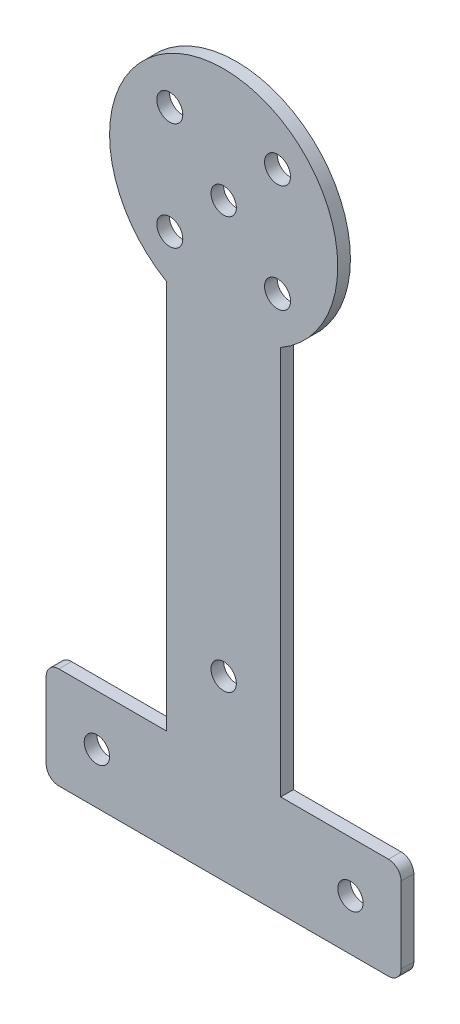
ISO-10303-21;
HEADER;
FILE_DESCRIPTION(('STEP AP214'),'2;1');
FILE_NAME('part.step','',(''),(''),'','','');
FILE_SCHEMA(('AUTOMOTIVE_DESIGN { 1 0 10303 214 1 1 1 1 }'));
ENDSEC;
DATA;
#1=APPLICATION_CONTEXT('core data for automotive mechanical design processes');
#2=APPLICATION_PROTOCOL_DEFINITION('international standard','automotive_design',2000,#1);
#3=PRODUCT_CONTEXT('',#1,'mechanical');
#4=PRODUCT('Part','Part','',(#3));
#5=PRODUCT_RELATED_PRODUCT_CATEGORY('part','',(#4));
#6=PRODUCT_DEFINITION_FORMATION('','',#4);
#7=PRODUCT_DEFINITION_CONTEXT('part definition',#1,'design');
#8=PRODUCT_DEFINITION('design','',#6,#7);
#9=PRODUCT_DEFINITION_SHAPE('','',#8);
#10=(LENGTH_UNIT() NAMED_UNIT(*) SI_UNIT(.MILLI.,.METRE.));
#11=(NAMED_UNIT(*) PLANE_ANGLE_UNIT() SI_UNIT($,.RADIAN.));
#12=(NAMED_UNIT(*) SI_UNIT($,.STERADIAN.) SOLID_ANGLE_UNIT());
#13=UNCERTAINTY_MEASURE_WITH_UNIT(LENGTH_MEASURE(1.E-05),#10,'distance_accuracy_value','');
#14=(GEOMETRIC_REPRESENTATION_CONTEXT(3) GLOBAL_UNCERTAINTY_ASSIGNED_CONTEXT((#13)) GLOBAL_UNIT_ASSIGNED_CONTEXT((#10,
#11,#12)) REPRESENTATION_CONTEXT('',''));
#15=CARTESIAN_POINT('',(0.,0.,0.));
#16=DIRECTION('',(0.,0.,1.));
#17=DIRECTION('',(1.,0.,0.));
#18=AXIS2_PLACEMENT_3D('',#15,#16,#17);
#19=CARTESIAN_POINT('',(-13.3404490284892,112.565520937774,2.));
#20=DIRECTION('',(0.,0.,-1.));
#21=DIRECTION('',(-1.,0.,0.));
#22=AXIS2_PLACEMENT_3D('',#19,#20,#21);
#23=PLANE('',#22);
#24=DIRECTION('',(0.,1.,0.));
#25=VECTOR('',#24,1.);
#26=CARTESIAN_POINT('',(14.6595509715108,19.5655209377735,2.));
#27=LINE('',#26,#25);
#28=CARTESIAN_POINT('',(14.6595509715108,21.5655209377735,2.));
#29=VERTEX_POINT('',#28);
#30=CARTESIAN_POINT('',(14.6595509715108,33.5655209377735,2.));
#31=VERTEX_POINT('',#30);
#32=EDGE_CURVE('E134',#29,#31,#27,.T.);
#33=ORIENTED_EDGE('',*,*,#32,.T.);
#34=CARTESIAN_POINT('',(12.6595509715108,33.5655209377735,2.));
#35=DIRECTION('',(0.,0.,-1.));
#36=DIRECTION('',(-1.,0.,0.));
#37=AXIS2_PLACEMENT_3D('',#34,#35,#36);
#38=CIRCLE('',#37,2.);
#39=CARTESIAN_POINT('',(12.6595509715108,35.5655209377735,2.));
#40=VERTEX_POINT('',#39);
#41=EDGE_CURVE('E130',#31,#40,#38,.F.);
#42=ORIENTED_EDGE('',*,*,#41,.T.);
#43=DIRECTION('',(-1.,0.,0.));
#44=VECTOR('',#43,1.);
#45=CARTESIAN_POINT('',(-4.34044902848922,35.5655209377735,2.));
#46=LINE('',#45,#44);
#47=CARTESIAN_POINT('',(-4.34044902848922,35.5655209377735,2.));
#48=VERTEX_POINT('',#47);
#49=EDGE_CURVE('E122',#40,#48,#46,.T.);
#50=ORIENTED_EDGE('',*,*,#49,.T.);
#51=DIRECTION('',(0.,1.,0.));
#52=VECTOR('',#51,1.);
#53=CARTESIAN_POINT('',(-4.34044902848922,35.5655209377735,2.));
#54=LINE('',#53,#52);
#55=CARTESIAN_POINT('',(-4.34044902848922,96.9770636696536,2.));
#56=VERTEX_POINT('',#55);
#57=EDGE_CURVE('E127',#48,#56,#54,.T.);
#58=ORIENTED_EDGE('',*,*,#57,.T.);
#59=CARTESIAN_POINT('',(-13.3404490284892,112.565520937774,2.));
#60=DIRECTION('',(0.,0.,1.));
#61=DIRECTION('',(-1.,0.,0.));
#62=AXIS2_PLACEMENT_3D('',#59,#60,#61);
#63=CIRCLE('',#62,18.);
#64=CARTESIAN_POINT('',(-22.3404490284892,96.9770636696536,2.));
#65=VERTEX_POINT('',#64);
#66=EDGE_CURVE('E149',#56,#65,#63,.T.);
#67=ORIENTED_EDGE('',*,*,#66,.T.);
#68=DIRECTION('',(0.,-1.,0.));
#69=VECTOR('',#68,1.);
#70=CARTESIAN_POINT('',(-22.3404490284892,35.5655209377735,2.));
#71=LINE('',#70,#69);
#72=CARTESIAN_POINT('',(-22.3404490284892,35.5655209377735,2.));
#73=VERTEX_POINT('',#72);
#74=EDGE_CURVE('E151',#65,#73,#71,.T.);
#75=ORIENTED_EDGE('',*,*,#74,.T.);
#76=DIRECTION('',(-1.,0.,0.));
#77=VECTOR('',#76,1.);
#78=CARTESIAN_POINT('',(-41.3404490284892,35.5655209377735,2.));
#79=LINE('',#78,#77);
#80=CARTESIAN_POINT('',(-39.3404490284892,35.5655209377735,2.));
#81=VERTEX_POINT('',#80);
#82=EDGE_CURVE('E156',#73,#81,#79,.T.);
#83=ORIENTED_EDGE('',*,*,#82,.T.);
#84=CARTESIAN_POINT('',(-39.3404490284892,33.5655209377735,2.));
#85=DIRECTION('',(0.,0.,-1.));
#86=DIRECTION('',(-1.,0.,0.));
#87=AXIS2_PLACEMENT_3D('',#84,#85,#86);
#88=CIRCLE('',#87,2.);
#89=CARTESIAN_POINT('',(-41.3404490284892,33.5655209377735,2.));
#90=VERTEX_POINT('',#89);
#91=EDGE_CURVE('E56',#81,#90,#88,.F.);
#92=ORIENTED_EDGE('',*,*,#91,.T.);
#93=DIRECTION('',(0.,-1.,0.));
#94=VECTOR('',#93,1.);
#95=CARTESIAN_POINT('',(-41.3404490284892,19.5655209377735,2.));
#96=LINE('',#95,#94);
#97=CARTESIAN_POINT('',(-41.3404490284892,21.5655209377735,2.));
#98=VERTEX_POINT('',#97);
#99=EDGE_CURVE('E158',#90,#98,#96,.T.);
#100=ORIENTED_EDGE('',*,*,#99,.T.);
#101=CARTESIAN_POINT('',(-39.3404490284892,21.5655209377735,2.));
#102=DIRECTION('',(0.,0.,-1.));
#103=DIRECTION('',(-1.,0.,0.));
#104=AXIS2_PLACEMENT_3D('',#101,#102,#103);
#105=CIRCLE('',#104,2.);
#106=CARTESIAN_POINT('',(-39.3404490284892,19.5655209377735,2.));
#107=VERTEX_POINT('',#106);
#108=EDGE_CURVE('E202',#98,#107,#105,.F.);
#109=ORIENTED_EDGE('',*,*,#108,.T.);
#110=DIRECTION('',(1.,0.,0.));
#111=VECTOR('',#110,1.);
#112=CARTESIAN_POINT('',(-41.3404490284892,19.5655209377735,2.));
#113=LINE('',#112,#111);
#114=CARTESIAN_POINT('',(12.6595509715108,19.5655209377735,2.));
#115=VERTEX_POINT('',#114);
#116=EDGE_CURVE('E180',#107,#115,#113,.T.);
#117=ORIENTED_EDGE('',*,*,#116,.T.);
#118=CARTESIAN_POINT('',(12.6595509715108,21.5655209377735,2.));
#119=DIRECTION('',(0.,0.,-1.));
#120=DIRECTION('',(-1.,0.,0.));
#121=AXIS2_PLACEMENT_3D('',#118,#119,#120);
#122=CIRCLE('',#121,2.);
#123=EDGE_CURVE('E204',#115,#29,#122,.F.);
#124=ORIENTED_EDGE('',*,*,#123,.T.);
#125=EDGE_LOOP('',(#33,#42,#50,#58,#67,#75,#83,#92,#100,#109,#117,#124));
#126=FACE_BOUND('',#125,.T.);
#127=CARTESIAN_POINT('',(-4.84044902848922,121.065520937774,2.));
#128=DIRECTION('',(0.,0.,1.));
#129=DIRECTION('',(1.,0.,0.));
#130=AXIS2_PLACEMENT_3D('',#127,#128,#129);
#131=CIRCLE('',#130,2.05);
#132=CARTESIAN_POINT('',(-2.79044902848922,121.065520937774,2.));
#133=VERTEX_POINT('',#132);
#134=EDGE_CURVE('E165',#133,#133,#131,.T.);
#135=ORIENTED_EDGE('',*,*,#134,.F.);
#136=EDGE_LOOP('',(#135));
#137=FACE_BOUND('',#136,.T.);
#138=CARTESIAN_POINT('',(-33.3404490284892,27.5655209377735,2.));
#139=DIRECTION('',(0.,0.,1.));
#140=DIRECTION('',(1.,0.,0.));
#141=AXIS2_PLACEMENT_3D('',#138,#139,#140);
#142=CIRCLE('',#141,2.);
#143=CARTESIAN_POINT('',(-31.3404490284892,27.5655209377735,2.));
#144=VERTEX_POINT('',#143);
#145=EDGE_CURVE('E238',#144,#144,#142,.T.);
#146=ORIENTED_EDGE('',*,*,#145,.F.);
#147=EDGE_LOOP('',(#146));
#148=FACE_BOUND('',#147,.T.);
#149=CARTESIAN_POINT('',(6.65955097151078,27.5655209377735,2.));
#150=DIRECTION('',(0.,0.,1.));
#151=DIRECTION('',(-1.,0.,0.));
#152=AXIS2_PLACEMENT_3D('',#149,#150,#151);
#153=CIRCLE('',#152,2.00000000000001);
#154=CARTESIAN_POINT('',(4.65955097151077,27.5655209377735,2.));
#155=VERTEX_POINT('',#154);
#156=EDGE_CURVE('E244',#155,#155,#153,.T.);
#157=ORIENTED_EDGE('',*,*,#156,.F.);
#158=EDGE_LOOP('',(#157));
#159=FACE_BOUND('',#158,.T.);
#160=CARTESIAN_POINT('',(-13.3404490284892,112.565520937774,2.));
#161=DIRECTION('',(0.,0.,1.));
#162=DIRECTION('',(1.,0.,0.));
#163=AXIS2_PLACEMENT_3D('',#160,#161,#162);
#164=CIRCLE('',#163,2.);
#165=CARTESIAN_POINT('',(-11.3404490284892,112.565520937774,2.));
#166=VERTEX_POINT('',#165);
#167=EDGE_CURVE('E250',#166,#166,#164,.T.);
#168=ORIENTED_EDGE('',*,*,#167,.F.);
#169=EDGE_LOOP('',(#168));
#170=FACE_BOUND('',#169,.T.);
#171=CARTESIAN_POINT('',(-4.840449028489,104.065520937773,2.));
#172=DIRECTION('',(0.,0.,1.));
#173=DIRECTION('',(1.,0.,0.));
#174=AXIS2_PLACEMENT_3D('',#171,#172,#173);
#175=CIRCLE('',#174,2.04999999999999);
#176=CARTESIAN_POINT('',(-2.79044902848901,104.065520937773,2.));
#177=VERTEX_POINT('',#176);
#178=EDGE_CURVE('E256',#177,#177,#175,.T.);
#179=ORIENTED_EDGE('',*,*,#178,.F.);
#180=EDGE_LOOP('',(#179));
#181=FACE_BOUND('',#180,.T.);
#182=CARTESIAN_POINT('',(-21.840449028489,104.065520937773,2.));
#183=DIRECTION('',(0.,0.,1.));
#184=DIRECTION('',(1.,0.,0.));
#185=AXIS2_PLACEMENT_3D('',#182,#183,#184);
#186=CIRCLE('',#185,2.05);
#187=CARTESIAN_POINT('',(-19.790449028489,104.065520937773,2.));
#188=VERTEX_POINT('',#187);
#189=EDGE_CURVE('E262',#188,#188,#186,.T.);
#190=ORIENTED_EDGE('',*,*,#189,.F.);
#191=EDGE_LOOP('',(#190));
#192=FACE_BOUND('',#191,.T.);
#193=CARTESIAN_POINT('',(-21.8404490284892,121.065520937773,2.));
#194=DIRECTION('',(0.,0.,1.));
#195=DIRECTION('',(1.,0.,0.));
#196=AXIS2_PLACEMENT_3D('',#193,#194,#195);
#197=CIRCLE('',#196,2.05);
#198=CARTESIAN_POINT('',(-19.7904490284892,121.065520937773,2.));
#199=VERTEX_POINT('',#198);
#200=EDGE_CURVE('E268',#199,#199,#197,.T.);
#201=ORIENTED_EDGE('',*,*,#200,.F.);
#202=EDGE_LOOP('',(#201));
#203=FACE_BOUND('',#202,.T.);
#204=CARTESIAN_POINT('',(-13.3404490284892,47.5655209377735,2.));
#205=DIRECTION('',(0.,0.,1.));
#206=DIRECTION('',(1.,0.,0.));
#207=AXIS2_PLACEMENT_3D('',#204,#205,#206);
#208=CIRCLE('',#207,2.00000000000001);
#209=CARTESIAN_POINT('',(-11.3404490284892,47.5655209377735,2.));
#210=VERTEX_POINT('',#209);
#211=EDGE_CURVE('E274',#210,#210,#208,.T.);
#212=ORIENTED_EDGE('',*,*,#211,.F.);
#213=EDGE_LOOP('',(#212));
#214=FACE_BOUND('',#213,.T.);
#215=ADVANCED_FACE('F35',(#126,#137,#148,#159,#170,#181,#192,#203,#214),#23,.F.);
#216=CARTESIAN_POINT('',(-13.3404490284892,112.565520937774,0.));
#217=DIRECTION('',(0.,0.,-1.));
#218=DIRECTION('',(-1.,0.,0.));
#219=AXIS2_PLACEMENT_3D('',#216,#217,#218);
#220=PLANE('',#219);
#221=CARTESIAN_POINT('',(-21.8404490284892,121.065520937773,0.));
#222=DIRECTION('',(0.,0.,1.));
#223=DIRECTION('',(1.,0.,0.));
#224=AXIS2_PLACEMENT_3D('',#221,#222,#223);
#225=CIRCLE('',#224,2.05);
#226=CARTESIAN_POINT('',(-19.7904490284892,121.065520937773,0.));
#227=VERTEX_POINT('',#226);
#228=EDGE_CURVE('E271',#227,#227,#225,.T.);
#229=ORIENTED_EDGE('',*,*,#228,.T.);
#230=EDGE_LOOP('',(#229));
#231=FACE_BOUND('',#230,.T.);
#232=CARTESIAN_POINT('',(-4.840449028489,104.065520937773,0.));
#233=DIRECTION('',(0.,0.,1.));
#234=DIRECTION('',(1.,0.,0.));
#235=AXIS2_PLACEMENT_3D('',#232,#233,#234);
#236=CIRCLE('',#235,2.04999999999999);
#237=CARTESIAN_POINT('',(-2.79044902848901,104.065520937773,0.));
#238=VERTEX_POINT('',#237);
#239=EDGE_CURVE('E259',#238,#238,#236,.T.);
#240=ORIENTED_EDGE('',*,*,#239,.T.);
#241=EDGE_LOOP('',(#240));
#242=FACE_BOUND('',#241,.T.);
#243=CARTESIAN_POINT('',(6.65955097151078,27.5655209377735,0.));
#244=DIRECTION('',(0.,0.,1.));
#245=DIRECTION('',(-1.,0.,0.));
#246=AXIS2_PLACEMENT_3D('',#243,#244,#245);
#247=CIRCLE('',#246,2.00000000000001);
#248=CARTESIAN_POINT('',(4.65955097151077,27.5655209377735,0.));
#249=VERTEX_POINT('',#248);
#250=EDGE_CURVE('E247',#249,#249,#247,.T.);
#251=ORIENTED_EDGE('',*,*,#250,.T.);
#252=EDGE_LOOP('',(#251));
#253=FACE_BOUND('',#252,.T.);
#254=CARTESIAN_POINT('',(-4.84044902848922,121.065520937774,0.));
#255=DIRECTION('',(0.,0.,1.));
#256=DIRECTION('',(1.,0.,0.));
#257=AXIS2_PLACEMENT_3D('',#254,#255,#256);
#258=CIRCLE('',#257,2.05);
#259=CARTESIAN_POINT('',(-2.79044902848922,121.065520937774,0.));
#260=VERTEX_POINT('',#259);
#261=EDGE_CURVE('E235',#260,#260,#258,.T.);
#262=ORIENTED_EDGE('',*,*,#261,.T.);
#263=EDGE_LOOP('',(#262));
#264=FACE_BOUND('',#263,.T.);
#265=DIRECTION('',(-1.,0.,0.));
#266=VECTOR('',#265,1.);
#267=CARTESIAN_POINT('',(-4.34044902848922,35.5655209377735,0.));
#268=LINE('',#267,#266);
#269=CARTESIAN_POINT('',(12.6595509715108,35.5655209377735,0.));
#270=VERTEX_POINT('',#269);
#271=CARTESIAN_POINT('',(-4.34044902848922,35.5655209377735,0.));
#272=VERTEX_POINT('',#271);
#273=EDGE_CURVE('E140',#270,#272,#268,.T.);
#274=ORIENTED_EDGE('',*,*,#273,.F.);
#275=CARTESIAN_POINT('',(12.6595509715108,33.5655209377735,0.));
#276=DIRECTION('',(0.,0.,-1.));
#277=DIRECTION('',(-1.,0.,0.));
#278=AXIS2_PLACEMENT_3D('',#275,#276,#277);
#279=CIRCLE('',#278,2.);
#280=CARTESIAN_POINT('',(14.6595509715108,33.5655209377735,0.));
#281=VERTEX_POINT('',#280);
#282=EDGE_CURVE('E194',#270,#281,#279,.T.);
#283=ORIENTED_EDGE('',*,*,#282,.T.);
#284=DIRECTION('',(0.,1.,0.));
#285=VECTOR('',#284,1.);
#286=CARTESIAN_POINT('',(14.6595509715108,19.5655209377735,0.));
#287=LINE('',#286,#285);
#288=CARTESIAN_POINT('',(14.6595509715108,21.5655209377735,0.));
#289=VERTEX_POINT('',#288);
#290=EDGE_CURVE('E164',#289,#281,#287,.T.);
#291=ORIENTED_EDGE('',*,*,#290,.F.);
#292=CARTESIAN_POINT('',(12.6595509715108,21.5655209377735,0.));
#293=DIRECTION('',(0.,0.,-1.));
#294=DIRECTION('',(-1.,0.,0.));
#295=AXIS2_PLACEMENT_3D('',#292,#293,#294);
#296=CIRCLE('',#295,2.);
#297=CARTESIAN_POINT('',(12.6595509715108,19.5655209377735,0.));
#298=VERTEX_POINT('',#297);
#299=EDGE_CURVE('E192',#289,#298,#296,.T.);
#300=ORIENTED_EDGE('',*,*,#299,.T.);
#301=DIRECTION('',(1.,0.,0.));
#302=VECTOR('',#301,1.);
#303=CARTESIAN_POINT('',(-41.3404490284892,19.5655209377735,0.));
#304=LINE('',#303,#302);
#305=CARTESIAN_POINT('',(-39.3404490284892,19.5655209377735,0.));
#306=VERTEX_POINT('',#305);
#307=EDGE_CURVE('E161',#306,#298,#304,.T.);
#308=ORIENTED_EDGE('',*,*,#307,.F.);
#309=CARTESIAN_POINT('',(-39.3404490284892,21.5655209377735,0.));
#310=DIRECTION('',(0.,0.,-1.));
#311=DIRECTION('',(-1.,0.,0.));
#312=AXIS2_PLACEMENT_3D('',#309,#310,#311);
#313=CIRCLE('',#312,2.);
#314=CARTESIAN_POINT('',(-41.3404490284892,21.5655209377735,0.));
#315=VERTEX_POINT('',#314);
#316=EDGE_CURVE('E190',#306,#315,#313,.T.);
#317=ORIENTED_EDGE('',*,*,#316,.T.);
#318=DIRECTION('',(0.,-1.,0.));
#319=VECTOR('',#318,1.);
#320=CARTESIAN_POINT('',(-41.3404490284892,19.5655209377735,0.));
#321=LINE('',#320,#319);
#322=CARTESIAN_POINT('',(-41.3404490284892,33.5655209377735,0.));
#323=VERTEX_POINT('',#322);
#324=EDGE_CURVE('E178',#323,#315,#321,.T.);
#325=ORIENTED_EDGE('',*,*,#324,.F.);
#326=CARTESIAN_POINT('',(-39.3404490284892,33.5655209377735,0.));
#327=DIRECTION('',(0.,0.,-1.));
#328=DIRECTION('',(-1.,0.,0.));
#329=AXIS2_PLACEMENT_3D('',#326,#327,#328);
#330=CIRCLE('',#329,2.);
#331=CARTESIAN_POINT('',(-39.3404490284892,35.5655209377735,0.));
#332=VERTEX_POINT('',#331);
#333=EDGE_CURVE('E188',#323,#332,#330,.T.);
#334=ORIENTED_EDGE('',*,*,#333,.T.);
#335=DIRECTION('',(-1.,0.,0.));
#336=VECTOR('',#335,1.);
#337=CARTESIAN_POINT('',(-41.3404490284892,35.5655209377735,0.));
#338=LINE('',#337,#336);
#339=CARTESIAN_POINT('',(-22.3404490284892,35.5655209377735,0.));
#340=VERTEX_POINT('',#339);
#341=EDGE_CURVE('E175',#340,#332,#338,.T.);
#342=ORIENTED_EDGE('',*,*,#341,.F.);
#343=DIRECTION('',(0.,-1.,0.));
#344=VECTOR('',#343,1.);
#345=CARTESIAN_POINT('',(-22.3404490284892,35.5655209377735,0.));
#346=LINE('',#345,#344);
#347=CARTESIAN_POINT('',(-22.3404490284892,96.9770636696536,0.));
#348=VERTEX_POINT('',#347);
#349=EDGE_CURVE('E173',#348,#340,#346,.T.);
#350=ORIENTED_EDGE('',*,*,#349,.F.);
#351=CARTESIAN_POINT('',(-13.3404490284892,112.565520937774,0.));
#352=DIRECTION('',(0.,0.,1.));
#353=DIRECTION('',(-1.,0.,0.));
#354=AXIS2_PLACEMENT_3D('',#351,#352,#353);
#355=CIRCLE('',#354,18.);
#356=CARTESIAN_POINT('',(-4.34044902848922,96.9770636696536,0.));
#357=VERTEX_POINT('',#356);
#358=EDGE_CURVE('E171',#357,#348,#355,.T.);
#359=ORIENTED_EDGE('',*,*,#358,.F.);
#360=DIRECTION('',(0.,1.,0.));
#361=VECTOR('',#360,1.);
#362=CARTESIAN_POINT('',(-4.34044902848922,35.5655209377735,0.));
#363=LINE('',#362,#361);
#364=EDGE_CURVE('E169',#272,#357,#363,.T.);
#365=ORIENTED_EDGE('',*,*,#364,.F.);
#366=EDGE_LOOP('',(#274,#283,#291,#300,#308,#317,#325,#334,#342,#350,#359,#365));
#367=FACE_BOUND('',#366,.T.);
#368=CARTESIAN_POINT('',(-33.3404490284892,27.5655209377735,0.));
#369=DIRECTION('',(0.,0.,1.));
#370=DIRECTION('',(1.,0.,0.));
#371=AXIS2_PLACEMENT_3D('',#368,#369,#370);
#372=CIRCLE('',#371,2.);
#373=CARTESIAN_POINT('',(-31.3404490284892,27.5655209377735,0.));
#374=VERTEX_POINT('',#373);
#375=EDGE_CURVE('E241',#374,#374,#372,.T.);
#376=ORIENTED_EDGE('',*,*,#375,.T.);
#377=EDGE_LOOP('',(#376));
#378=FACE_BOUND('',#377,.T.);
#379=CARTESIAN_POINT('',(-13.3404490284892,112.565520937774,0.));
#380=DIRECTION('',(0.,0.,1.));
#381=DIRECTION('',(1.,0.,0.));
#382=AXIS2_PLACEMENT_3D('',#379,#380,#381);
#383=CIRCLE('',#382,2.);
#384=CARTESIAN_POINT('',(-11.3404490284892,112.565520937774,0.));
#385=VERTEX_POINT('',#384);
#386=EDGE_CURVE('E253',#385,#385,#383,.T.);
#387=ORIENTED_EDGE('',*,*,#386,.T.);
#388=EDGE_LOOP('',(#387));
#389=FACE_BOUND('',#388,.T.);
#390=CARTESIAN_POINT('',(-21.840449028489,104.065520937773,0.));
#391=DIRECTION('',(0.,0.,1.));
#392=DIRECTION('',(1.,0.,0.));
#393=AXIS2_PLACEMENT_3D('',#390,#391,#392);
#394=CIRCLE('',#393,2.05);
#395=CARTESIAN_POINT('',(-19.790449028489,104.065520937773,0.));
#396=VERTEX_POINT('',#395);
#397=EDGE_CURVE('E265',#396,#396,#394,.T.);
#398=ORIENTED_EDGE('',*,*,#397,.T.);
#399=EDGE_LOOP('',(#398));
#400=FACE_BOUND('',#399,.T.);
#401=CARTESIAN_POINT('',(-13.3404490284892,47.5655209377735,0.));
#402=DIRECTION('',(0.,0.,1.));
#403=DIRECTION('',(1.,0.,0.));
#404=AXIS2_PLACEMENT_3D('',#401,#402,#403);
#405=CIRCLE('',#404,2.00000000000001);
#406=CARTESIAN_POINT('',(-11.3404490284892,47.5655209377735,0.));
#407=VERTEX_POINT('',#406);
#408=EDGE_CURVE('E277',#407,#407,#405,.T.);
#409=ORIENTED_EDGE('',*,*,#408,.T.);
#410=EDGE_LOOP('',(#409));
#411=FACE_BOUND('',#410,.T.);
#412=ADVANCED_FACE('F219',(#231,#242,#253,#264,#367,#378,#389,#400,#411),#220,.T.);
#413=CARTESIAN_POINT('',(-41.3404490284892,19.5655209377735,2.));
#414=DIRECTION('',(0.,1.,0.));
#415=DIRECTION('',(0.,0.,1.));
#416=AXIS2_PLACEMENT_3D('',#413,#414,#415);
#417=PLANE('',#416);
#418=ORIENTED_EDGE('',*,*,#307,.T.);
#419=DIRECTION('',(0.,0.,-1.));
#420=VECTOR('',#419,1.);
#421=CARTESIAN_POINT('',(12.6595509715108,19.5655209377735,2.));
#422=LINE('',#421,#420);
#423=EDGE_CURVE('E210',#298,#115,#422,.F.);
#424=ORIENTED_EDGE('',*,*,#423,.T.);
#425=ORIENTED_EDGE('',*,*,#116,.F.);
#426=DIRECTION('',(0.,0.,-1.));
#427=VECTOR('',#426,1.);
#428=CARTESIAN_POINT('',(-39.3404490284892,19.5655209377735,2.));
#429=LINE('',#428,#427);
#430=EDGE_CURVE('E207',#107,#306,#429,.T.);
#431=ORIENTED_EDGE('',*,*,#430,.T.);
#432=EDGE_LOOP('',(#418,#424,#425,#431));
#433=FACE_BOUND('',#432,.T.);
#434=ADVANCED_FACE('F229',(#433),#417,.F.);
#435=CARTESIAN_POINT('',(14.6595509715108,19.5655209377735,2.));
#436=DIRECTION('',(-1.,0.,0.));
#437=DIRECTION('',(0.,0.,1.));
#438=AXIS2_PLACEMENT_3D('',#435,#436,#437);
#439=PLANE('',#438);
#440=ORIENTED_EDGE('',*,*,#290,.T.);
#441=DIRECTION('',(0.,0.,-1.));
#442=VECTOR('',#441,1.);
#443=CARTESIAN_POINT('',(14.6595509715108,33.5655209377735,2.));
#444=LINE('',#443,#442);
#445=EDGE_CURVE('E199',#281,#31,#444,.F.);
#446=ORIENTED_EDGE('',*,*,#445,.T.);
#447=ORIENTED_EDGE('',*,*,#32,.F.);
#448=DIRECTION('',(0.,0.,-1.));
#449=VECTOR('',#448,1.);
#450=CARTESIAN_POINT('',(14.6595509715108,21.5655209377735,2.));
#451=LINE('',#450,#449);
#452=EDGE_CURVE('E196',#29,#289,#451,.T.);
#453=ORIENTED_EDGE('',*,*,#452,.T.);
#454=EDGE_LOOP('',(#440,#446,#447,#453));
#455=FACE_BOUND('',#454,.T.);
#456=ADVANCED_FACE('F315',(#455),#439,.F.);
#457=CARTESIAN_POINT('',(-4.34044902848922,35.5655209377735,2.));
#458=DIRECTION('',(0.,-1.,0.));
#459=DIRECTION('',(0.,0.,-1.));
#460=AXIS2_PLACEMENT_3D('',#457,#458,#459);
#461=PLANE('',#460);
#462=ORIENTED_EDGE('',*,*,#49,.F.);
#463=DIRECTION('',(0.,0.,-1.));
#464=VECTOR('',#463,1.);
#465=CARTESIAN_POINT('',(12.6595509715108,35.5655209377735,2.));
#466=LINE('',#465,#464);
#467=EDGE_CURVE('E143',#40,#270,#466,.T.);
#468=ORIENTED_EDGE('',*,*,#467,.T.);
#469=ORIENTED_EDGE('',*,*,#273,.T.);
#470=DIRECTION('',(0.,0.,-1.));
#471=VECTOR('',#470,1.);
#472=CARTESIAN_POINT('',(-4.34044902848922,35.5655209377735,2.));
#473=LINE('',#472,#471);
#474=EDGE_CURVE('E137',#48,#272,#473,.T.);
#475=ORIENTED_EDGE('',*,*,#474,.F.);
#476=EDGE_LOOP('',(#462,#468,#469,#475));
#477=FACE_BOUND('',#476,.T.);
#478=ADVANCED_FACE('F138',(#477),#461,.F.);
#479=CARTESIAN_POINT('',(-4.34044902848922,35.5655209377735,2.));
#480=DIRECTION('',(-1.,0.,0.));
#481=DIRECTION('',(0.,0.,1.));
#482=AXIS2_PLACEMENT_3D('',#479,#480,#481);
#483=PLANE('',#482);
#484=ORIENTED_EDGE('',*,*,#364,.T.);
#485=DIRECTION('',(0.,0.,-1.));
#486=VECTOR('',#485,1.);
#487=CARTESIAN_POINT('',(-4.34044902848922,96.9770636696536,2.));
#488=LINE('',#487,#486);
#489=EDGE_CURVE('E144',#56,#357,#488,.T.);
#490=ORIENTED_EDGE('',*,*,#489,.F.);
#491=ORIENTED_EDGE('',*,*,#57,.F.);
#492=ORIENTED_EDGE('',*,*,#474,.T.);
#493=EDGE_LOOP('',(#484,#490,#491,#492));
#494=FACE_BOUND('',#493,.T.);
#495=ADVANCED_FACE('F146',(#494),#483,.F.);
#496=CARTESIAN_POINT('',(-13.3404490284892,112.565520937774,2.));
#497=DIRECTION('',(0.,0.,-1.));
#498=DIRECTION('',(-1.,0.,0.));
#499=AXIS2_PLACEMENT_3D('',#496,#497,#498);
#500=CYLINDRICAL_SURFACE('',#499,18.);
#501=ORIENTED_EDGE('',*,*,#358,.T.);
#502=DIRECTION('',(0.,0.,-1.));
#503=VECTOR('',#502,1.);
#504=CARTESIAN_POINT('',(-22.3404490284892,96.9770636696536,2.));
#505=LINE('',#504,#503);
#506=EDGE_CURVE('E183',#65,#348,#505,.T.);
#507=ORIENTED_EDGE('',*,*,#506,.F.);
#508=ORIENTED_EDGE('',*,*,#66,.F.);
#509=ORIENTED_EDGE('',*,*,#489,.T.);
#510=EDGE_LOOP('',(#501,#507,#508,#509));
#511=FACE_BOUND('',#510,.T.);
#512=ADVANCED_FACE('F306',(#511),#500,.T.);
#513=CARTESIAN_POINT('',(-22.3404490284892,35.5655209377735,2.));
#514=DIRECTION('',(1.,0.,0.));
#515=DIRECTION('',(0.,0.,-1.));
#516=AXIS2_PLACEMENT_3D('',#513,#514,#515);
#517=PLANE('',#516);
#518=ORIENTED_EDGE('',*,*,#349,.T.);
#519=DIRECTION('',(0.,0.,-1.));
#520=VECTOR('',#519,1.);
#521=CARTESIAN_POINT('',(-22.3404490284892,35.5655209377735,2.));
#522=LINE('',#521,#520);
#523=EDGE_CURVE('E160',#73,#340,#522,.T.);
#524=ORIENTED_EDGE('',*,*,#523,.F.);
#525=ORIENTED_EDGE('',*,*,#74,.F.);
#526=ORIENTED_EDGE('',*,*,#506,.T.);
#527=EDGE_LOOP('',(#518,#524,#525,#526));
#528=FACE_BOUND('',#527,.T.);
#529=ADVANCED_FACE('F302',(#528),#517,.F.);
#530=CARTESIAN_POINT('',(-41.3404490284892,35.5655209377735,2.));
#531=DIRECTION('',(0.,-1.,0.));
#532=DIRECTION('',(0.,0.,-1.));
#533=AXIS2_PLACEMENT_3D('',#530,#531,#532);
#534=PLANE('',#533);
#535=ORIENTED_EDGE('',*,*,#341,.T.);
#536=DIRECTION('',(0.,0.,-1.));
#537=VECTOR('',#536,1.);
#538=CARTESIAN_POINT('',(-39.3404490284892,35.5655209377735,2.));
#539=LINE('',#538,#537);
#540=EDGE_CURVE('E11',#332,#81,#539,.F.);
#541=ORIENTED_EDGE('',*,*,#540,.T.);
#542=ORIENTED_EDGE('',*,*,#82,.F.);
#543=ORIENTED_EDGE('',*,*,#523,.T.);
#544=EDGE_LOOP('',(#535,#541,#542,#543));
#545=FACE_BOUND('',#544,.T.);
#546=ADVANCED_FACE('F299',(#545),#534,.F.);
#547=CARTESIAN_POINT('',(-41.3404490284892,19.5655209377735,2.));
#548=DIRECTION('',(1.,0.,0.));
#549=DIRECTION('',(0.,0.,-1.));
#550=AXIS2_PLACEMENT_3D('',#547,#548,#549);
#551=PLANE('',#550);
#552=ORIENTED_EDGE('',*,*,#324,.T.);
#553=DIRECTION('',(0.,0.,-1.));
#554=VECTOR('',#553,1.);
#555=CARTESIAN_POINT('',(-41.3404490284892,21.5655209377735,2.));
#556=LINE('',#555,#554);
#557=EDGE_CURVE('E43',#315,#98,#556,.F.);
#558=ORIENTED_EDGE('',*,*,#557,.T.);
#559=ORIENTED_EDGE('',*,*,#99,.F.);
#560=DIRECTION('',(0.,0.,-1.));
#561=VECTOR('',#560,1.);
#562=CARTESIAN_POINT('',(-41.3404490284892,33.5655209377735,2.));
#563=LINE('',#562,#561);
#564=EDGE_CURVE('E212',#90,#323,#563,.T.);
#565=ORIENTED_EDGE('',*,*,#564,.T.);
#566=EDGE_LOOP('',(#552,#558,#559,#565));
#567=FACE_BOUND('',#566,.T.);
#568=ADVANCED_FACE('F216',(#567),#551,.F.);
#569=CARTESIAN_POINT('',(-4.84044902848922,121.065520937774,2.));
#570=DIRECTION('',(0.,0.,-1.));
#571=DIRECTION('',(-1.,0.,0.));
#572=AXIS2_PLACEMENT_3D('',#569,#570,#571);
#573=CYLINDRICAL_SURFACE('',#572,2.05);
#574=ORIENTED_EDGE('',*,*,#134,.T.);
#575=EDGE_LOOP('',(#574));
#576=FACE_BOUND('',#575,.T.);
#577=ORIENTED_EDGE('',*,*,#261,.F.);
#578=EDGE_LOOP('',(#577));
#579=FACE_BOUND('',#578,.T.);
#580=ADVANCED_FACE('F294',(#576,#579),#573,.F.);
#581=CARTESIAN_POINT('',(-33.3404490284892,27.5655209377735,2.));
#582=DIRECTION('',(0.,0.,-1.));
#583=DIRECTION('',(-1.,0.,0.));
#584=AXIS2_PLACEMENT_3D('',#581,#582,#583);
#585=CYLINDRICAL_SURFACE('',#584,2.);
#586=ORIENTED_EDGE('',*,*,#145,.T.);
#587=EDGE_LOOP('',(#586));
#588=FACE_BOUND('',#587,.T.);
#589=ORIENTED_EDGE('',*,*,#375,.F.);
#590=EDGE_LOOP('',(#589));
#591=FACE_BOUND('',#590,.T.);
#592=ADVANCED_FACE('F463',(#588,#591),#585,.F.);
#593=CARTESIAN_POINT('',(6.65955097151078,27.5655209377735,2.));
#594=DIRECTION('',(0.,0.,-1.));
#595=DIRECTION('',(-1.,0.,0.));
#596=AXIS2_PLACEMENT_3D('',#593,#594,#595);
#597=CYLINDRICAL_SURFACE('',#596,2.00000000000001);
#598=ORIENTED_EDGE('',*,*,#156,.T.);
#599=EDGE_LOOP('',(#598));
#600=FACE_BOUND('',#599,.T.);
#601=ORIENTED_EDGE('',*,*,#250,.F.);
#602=EDGE_LOOP('',(#601));
#603=FACE_BOUND('',#602,.T.);
#604=ADVANCED_FACE('F453',(#600,#603),#597,.F.);
#605=CARTESIAN_POINT('',(-13.3404490284892,112.565520937774,2.));
#606=DIRECTION('',(0.,0.,-1.));
#607=DIRECTION('',(-1.,0.,0.));
#608=AXIS2_PLACEMENT_3D('',#605,#606,#607);
#609=CYLINDRICAL_SURFACE('',#608,2.);
#610=ORIENTED_EDGE('',*,*,#167,.T.);
#611=EDGE_LOOP('',(#610));
#612=FACE_BOUND('',#611,.T.);
#613=ORIENTED_EDGE('',*,*,#386,.F.);
#614=EDGE_LOOP('',(#613));
#615=FACE_BOUND('',#614,.T.);
#616=ADVANCED_FACE('F443',(#612,#615),#609,.F.);
#617=CARTESIAN_POINT('',(-4.840449028489,104.065520937773,2.));
#618=DIRECTION('',(0.,0.,-1.));
#619=DIRECTION('',(-1.,0.,0.));
#620=AXIS2_PLACEMENT_3D('',#617,#618,#619);
#621=CYLINDRICAL_SURFACE('',#620,2.04999999999999);
#622=ORIENTED_EDGE('',*,*,#178,.T.);
#623=EDGE_LOOP('',(#622));
#624=FACE_BOUND('',#623,.T.);
#625=ORIENTED_EDGE('',*,*,#239,.F.);
#626=EDGE_LOOP('',(#625));
#627=FACE_BOUND('',#626,.T.);
#628=ADVANCED_FACE('F433',(#624,#627),#621,.F.);
#629=CARTESIAN_POINT('',(-21.840449028489,104.065520937773,2.));
#630=DIRECTION('',(0.,0.,-1.));
#631=DIRECTION('',(-1.,0.,0.));
#632=AXIS2_PLACEMENT_3D('',#629,#630,#631);
#633=CYLINDRICAL_SURFACE('',#632,2.05);
#634=ORIENTED_EDGE('',*,*,#189,.T.);
#635=EDGE_LOOP('',(#634));
#636=FACE_BOUND('',#635,.T.);
#637=ORIENTED_EDGE('',*,*,#397,.F.);
#638=EDGE_LOOP('',(#637));
#639=FACE_BOUND('',#638,.T.);
#640=ADVANCED_FACE('F423',(#636,#639),#633,.F.);
#641=CARTESIAN_POINT('',(-21.8404490284892,121.065520937773,2.));
#642=DIRECTION('',(0.,0.,-1.));
#643=DIRECTION('',(-1.,0.,0.));
#644=AXIS2_PLACEMENT_3D('',#641,#642,#643);
#645=CYLINDRICAL_SURFACE('',#644,2.05);
#646=ORIENTED_EDGE('',*,*,#200,.T.);
#647=EDGE_LOOP('',(#646));
#648=FACE_BOUND('',#647,.T.);
#649=ORIENTED_EDGE('',*,*,#228,.F.);
#650=EDGE_LOOP('',(#649));
#651=FACE_BOUND('',#650,.T.);
#652=ADVANCED_FACE('F414',(#648,#651),#645,.F.);
#653=CARTESIAN_POINT('',(-13.3404490284892,47.5655209377735,2.));
#654=DIRECTION('',(0.,0.,-1.));
#655=DIRECTION('',(-1.,0.,0.));
#656=AXIS2_PLACEMENT_3D('',#653,#654,#655);
#657=CYLINDRICAL_SURFACE('',#656,2.00000000000001);
#658=ORIENTED_EDGE('',*,*,#211,.T.);
#659=EDGE_LOOP('',(#658));
#660=FACE_BOUND('',#659,.T.);
#661=ORIENTED_EDGE('',*,*,#408,.F.);
#662=EDGE_LOOP('',(#661));
#663=FACE_BOUND('',#662,.T.);
#664=ADVANCED_FACE('F283',(#660,#663),#657,.F.);
#665=CARTESIAN_POINT('',(12.6595509715108,33.5655209377735,2.));
#666=DIRECTION('',(0.,0.,-1.));
#667=DIRECTION('',(-1.,0.,0.));
#668=AXIS2_PLACEMENT_3D('',#665,#666,#667);
#669=CYLINDRICAL_SURFACE('',#668,2.);
#670=ORIENTED_EDGE('',*,*,#41,.F.);
#671=ORIENTED_EDGE('',*,*,#445,.F.);
#672=ORIENTED_EDGE('',*,*,#282,.F.);
#673=ORIENTED_EDGE('',*,*,#467,.F.);
#674=EDGE_LOOP('',(#670,#671,#672,#673));
#675=FACE_BOUND('',#674,.T.);
#676=ADVANCED_FACE('F321',(#675),#669,.T.);
#677=CARTESIAN_POINT('',(12.6595509715108,21.5655209377735,2.));
#678=DIRECTION('',(0.,0.,-1.));
#679=DIRECTION('',(-1.,0.,0.));
#680=AXIS2_PLACEMENT_3D('',#677,#678,#679);
#681=CYLINDRICAL_SURFACE('',#680,2.);
#682=ORIENTED_EDGE('',*,*,#123,.F.);
#683=ORIENTED_EDGE('',*,*,#423,.F.);
#684=ORIENTED_EDGE('',*,*,#299,.F.);
#685=ORIENTED_EDGE('',*,*,#452,.F.);
#686=EDGE_LOOP('',(#682,#683,#684,#685));
#687=FACE_BOUND('',#686,.T.);
#688=ADVANCED_FACE('F324',(#687),#681,.T.);
#689=CARTESIAN_POINT('',(-39.3404490284892,21.5655209377735,2.));
#690=DIRECTION('',(0.,0.,-1.));
#691=DIRECTION('',(-1.,0.,0.));
#692=AXIS2_PLACEMENT_3D('',#689,#690,#691);
#693=CYLINDRICAL_SURFACE('',#692,2.);
#694=ORIENTED_EDGE('',*,*,#108,.F.);
#695=ORIENTED_EDGE('',*,*,#557,.F.);
#696=ORIENTED_EDGE('',*,*,#316,.F.);
#697=ORIENTED_EDGE('',*,*,#430,.F.);
#698=EDGE_LOOP('',(#694,#695,#696,#697));
#699=FACE_BOUND('',#698,.T.);
#700=ADVANCED_FACE('F226',(#699),#693,.T.);
#701=CARTESIAN_POINT('',(-39.3404490284892,33.5655209377735,2.));
#702=DIRECTION('',(0.,0.,-1.));
#703=DIRECTION('',(-1.,0.,0.));
#704=AXIS2_PLACEMENT_3D('',#701,#702,#703);
#705=CYLINDRICAL_SURFACE('',#704,2.);
#706=ORIENTED_EDGE('',*,*,#91,.F.);
#707=ORIENTED_EDGE('',*,*,#540,.F.);
#708=ORIENTED_EDGE('',*,*,#333,.F.);
#709=ORIENTED_EDGE('',*,*,#564,.F.);
#710=EDGE_LOOP('',(#706,#707,#708,#709));
#711=FACE_BOUND('',#710,.T.);
#712=ADVANCED_FACE('F37',(#711),#705,.T.);
#713=CLOSED_SHELL('',(#215,#412,#434,#456,#478,#495,#512,#529,#546,#568,#580,#592,#604,#616,
#628,#640,#652,#664,#676,#688,#700,#712));
#714=MANIFOLD_SOLID_BREP('B2',#713);
#715=ADVANCED_BREP_SHAPE_REPRESENTATION('',(#18,#714),#14);
#716=SHAPE_DEFINITION_REPRESENTATION(#9,#715);
ENDSEC;
END-ISO-10303-21;
